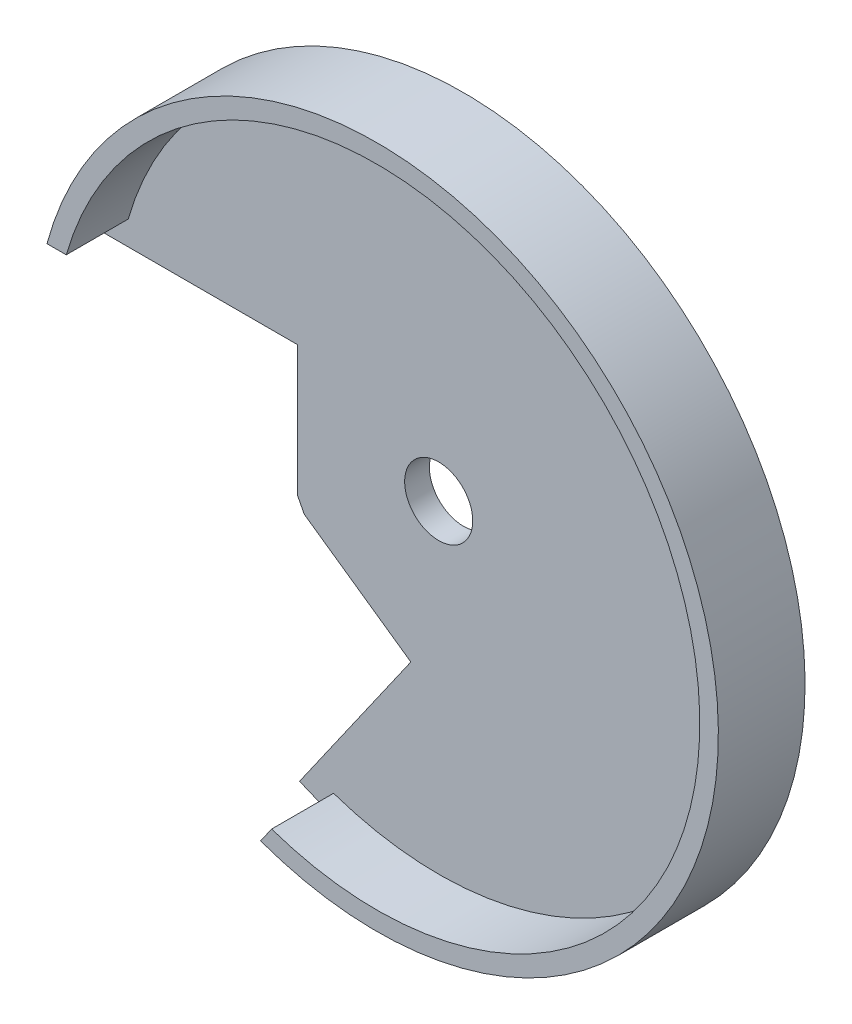
ISO-10303-21;
HEADER;
FILE_DESCRIPTION(('STEP AP214'),'2;1');
FILE_NAME('part.step','',(''),(''),'','','');
FILE_SCHEMA(('AUTOMOTIVE_DESIGN { 1 0 10303 214 1 1 1 1 }'));
ENDSEC;
DATA;
#1=APPLICATION_CONTEXT('core data for automotive mechanical design processes');
#2=APPLICATION_PROTOCOL_DEFINITION('international standard','automotive_design',2000,#1);
#3=PRODUCT_CONTEXT('',#1,'mechanical');
#4=PRODUCT('Part','Part','',(#3));
#5=PRODUCT_RELATED_PRODUCT_CATEGORY('part','',(#4));
#6=PRODUCT_DEFINITION_FORMATION('','',#4);
#7=PRODUCT_DEFINITION_CONTEXT('part definition',#1,'design');
#8=PRODUCT_DEFINITION('design','',#6,#7);
#9=PRODUCT_DEFINITION_SHAPE('','',#8);
#10=(LENGTH_UNIT() NAMED_UNIT(*) SI_UNIT(.MILLI.,.METRE.));
#11=(NAMED_UNIT(*) PLANE_ANGLE_UNIT() SI_UNIT($,.RADIAN.));
#12=(NAMED_UNIT(*) SI_UNIT($,.STERADIAN.) SOLID_ANGLE_UNIT());
#13=UNCERTAINTY_MEASURE_WITH_UNIT(LENGTH_MEASURE(1.E-05),#10,'distance_accuracy_value','');
#14=(GEOMETRIC_REPRESENTATION_CONTEXT(3) GLOBAL_UNCERTAINTY_ASSIGNED_CONTEXT((#13)) GLOBAL_UNIT_ASSIGNED_CONTEXT((#10,
#11,#12)) REPRESENTATION_CONTEXT('',''));
#15=CARTESIAN_POINT('',(0.,0.,0.));
#16=DIRECTION('',(0.,0.,1.));
#17=DIRECTION('',(1.,0.,0.));
#18=AXIS2_PLACEMENT_3D('',#15,#16,#17);
#19=CARTESIAN_POINT('',(2.72554252903729,-1.90844542454305,3.));
#20=DIRECTION('',(0.819152044288993,-0.573576436351044,0.));
#21=DIRECTION('',(0.573576436351044,0.819152044288994,0.));
#22=AXIS2_PLACEMENT_3D('',#19,#20,#21);
#23=PLANE('',#22);
#24=DIRECTION('',(0.,0.,-1.));
#25=VECTOR('',#24,1.);
#26=CARTESIAN_POINT('',(3.79495970659084,-0.381159414044166,7.2));
#27=LINE('',#26,#25);
#28=CARTESIAN_POINT('',(3.79495970659084,-0.381159414044169,0.));
#29=VERTEX_POINT('',#28);
#30=CARTESIAN_POINT('',(3.79495970659084,-0.381159414044169,3.));
#31=VERTEX_POINT('',#30);
#32=EDGE_CURVE('E78',#29,#31,#27,.F.);
#33=ORIENTED_EDGE('',*,*,#32,.F.);
#34=DIRECTION('',(-0.573576436351044,-0.819152044288994,0.));
#35=VECTOR('',#34,1.);
#36=CARTESIAN_POINT('',(2.72554252903729,-1.90844542454305,0.));
#37=LINE('',#36,#35);
#38=CARTESIAN_POINT('',(3.2591057348042,-1.14643819575611,0.));
#39=VERTEX_POINT('',#38);
#40=EDGE_CURVE('E154',#29,#39,#37,.T.);
#41=ORIENTED_EDGE('',*,*,#40,.T.);
#42=DIRECTION('',(0.,0.,-1.));
#43=VECTOR('',#42,1.);
#44=CARTESIAN_POINT('',(3.2591057348042,-1.14643819575611,3.));
#45=LINE('',#44,#43);
#46=CARTESIAN_POINT('',(3.2591057348042,-1.14643819575611,3.));
#47=VERTEX_POINT('',#46);
#48=EDGE_CURVE('E174',#47,#39,#45,.T.);
#49=ORIENTED_EDGE('',*,*,#48,.F.);
#50=DIRECTION('',(-0.573576436351044,-0.819152044288994,0.));
#51=VECTOR('',#50,1.);
#52=CARTESIAN_POINT('',(2.72554252903729,-1.90844542454305,3.));
#53=LINE('',#52,#51);
#54=EDGE_CURVE('E162',#31,#47,#53,.T.);
#55=ORIENTED_EDGE('',*,*,#54,.F.);
#56=EDGE_LOOP('',(#33,#41,#49,#55));
#57=FACE_BOUND('',#56,.T.);
#58=ADVANCED_FACE('F62',(#57),#23,.F.);
#59=CARTESIAN_POINT('',(0.,18.7337143275698,3.));
#60=DIRECTION('',(0.,-1.,0.));
#61=DIRECTION('',(0.,0.,-1.));
#62=AXIS2_PLACEMENT_3D('',#59,#60,#61);
#63=PLANE('',#62);
#64=DIRECTION('',(-1.,0.,0.));
#65=VECTOR('',#64,1.);
#66=CARTESIAN_POINT('',(0.,18.7337143275698,0.));
#67=LINE('',#66,#65);
#68=CARTESIAN_POINT('',(-6.15561373875023,18.7337143275698,0.));
#69=VERTEX_POINT('',#68);
#70=CARTESIAN_POINT('',(-7.08984662878249,18.7337143275698,0.));
#71=VERTEX_POINT('',#70);
#72=EDGE_CURVE('E151',#69,#71,#67,.T.);
#73=ORIENTED_EDGE('',*,*,#72,.F.);
#74=DIRECTION('',(0.,0.,-1.));
#75=VECTOR('',#74,1.);
#76=CARTESIAN_POINT('',(-6.15561373875023,18.7337143275698,7.2));
#77=LINE('',#76,#75);
#78=CARTESIAN_POINT('',(-6.15561373875023,18.7337143275698,3.));
#79=VERTEX_POINT('',#78);
#80=EDGE_CURVE('E137',#69,#79,#77,.F.);
#81=ORIENTED_EDGE('',*,*,#80,.T.);
#82=DIRECTION('',(-1.,0.,0.));
#83=VECTOR('',#82,1.);
#84=CARTESIAN_POINT('',(0.,18.7337143275698,3.));
#85=LINE('',#84,#83);
#86=CARTESIAN_POINT('',(-7.08984662878249,18.7337143275698,3.));
#87=VERTEX_POINT('',#86);
#88=EDGE_CURVE('E175',#79,#87,#85,.T.);
#89=ORIENTED_EDGE('',*,*,#88,.T.);
#90=DIRECTION('',(0.,0.,-1.));
#91=VECTOR('',#90,1.);
#92=CARTESIAN_POINT('',(-7.08984662878249,18.7337143275698,3.));
#93=LINE('',#92,#91);
#94=EDGE_CURVE('E160',#87,#71,#93,.T.);
#95=ORIENTED_EDGE('',*,*,#94,.T.);
#96=EDGE_LOOP('',(#73,#81,#89,#95));
#97=FACE_BOUND('',#96,.T.);
#98=ADVANCED_FACE('F158',(#97),#63,.T.);
#99=CARTESIAN_POINT('',(8.8873210621277,14.4171633228282,3.));
#100=DIRECTION('',(0.,0.,-1.));
#101=DIRECTION('',(-1.,0.,0.));
#102=AXIS2_PLACEMENT_3D('',#99,#100,#101);
#103=CYLINDRICAL_SURFACE('',#102,16.55);
#104=CARTESIAN_POINT('',(8.8873210621277,14.4171633228282,0.));
#105=DIRECTION('',(0.,0.,-1.));
#106=DIRECTION('',(-1.,0.,0.));
#107=AXIS2_PLACEMENT_3D('',#104,#105,#106);
#108=CIRCLE('',#107,16.55);
#109=CARTESIAN_POINT('',(2.1484890263976,-0.698743622976164,0.));
#110=VERTEX_POINT('',#109);
#111=EDGE_CURVE('E184',#39,#110,#108,.T.);
#112=ORIENTED_EDGE('',*,*,#111,.T.);
#113=DIRECTION('',(0.,0.,-1.));
#114=VECTOR('',#113,1.);
#115=CARTESIAN_POINT('',(2.1484890263976,-0.698743622976164,7.2));
#116=LINE('',#115,#114);
#117=CARTESIAN_POINT('',(2.1484890263976,-0.698743622976164,-1.2));
#118=VERTEX_POINT('',#117);
#119=EDGE_CURVE('E168',#110,#118,#116,.T.);
#120=ORIENTED_EDGE('',*,*,#119,.T.);
#121=CARTESIAN_POINT('',(8.8873210621277,14.4171633228282,-1.2));
#122=DIRECTION('',(0.,0.,-1.));
#123=DIRECTION('',(-1.,0.,0.));
#124=AXIS2_PLACEMENT_3D('',#121,#122,#123);
#125=CIRCLE('',#124,16.55);
#126=CARTESIAN_POINT('',(-7.36014027803249,17.5671633228282,-1.2));
#127=VERTEX_POINT('',#126);
#128=EDGE_CURVE('E188',#127,#118,#125,.T.);
#129=ORIENTED_EDGE('',*,*,#128,.F.);
#130=DIRECTION('',(0.,0.,-1.));
#131=VECTOR('',#130,1.);
#132=CARTESIAN_POINT('',(-7.36014027803249,17.5671633228282,7.2));
#133=LINE('',#132,#131);
#134=CARTESIAN_POINT('',(-7.36014027803249,17.5671633228282,0.));
#135=VERTEX_POINT('',#134);
#136=EDGE_CURVE('E242',#135,#127,#133,.T.);
#137=ORIENTED_EDGE('',*,*,#136,.F.);
#138=EDGE_CURVE('E193',#135,#71,#108,.T.);
#139=ORIENTED_EDGE('',*,*,#138,.T.);
#140=ORIENTED_EDGE('',*,*,#94,.F.);
#141=CARTESIAN_POINT('',(8.8873210621277,14.4171633228282,3.));
#142=DIRECTION('',(0.,0.,1.));
#143=DIRECTION('',(1.,0.,0.));
#144=AXIS2_PLACEMENT_3D('',#141,#142,#143);
#145=CIRCLE('',#144,16.55);
#146=EDGE_CURVE('E166',#47,#87,#145,.T.);
#147=ORIENTED_EDGE('',*,*,#146,.F.);
#148=ORIENTED_EDGE('',*,*,#48,.T.);
#149=EDGE_LOOP('',(#112,#120,#129,#137,#139,#140,#147,#148));
#150=FACE_BOUND('',#149,.T.);
#151=ADVANCED_FACE('F64',(#150),#103,.T.);
#152=CARTESIAN_POINT('',(8.8873210621277,14.4171633228282,-1.2));
#153=DIRECTION('',(0.,0.,-1.));
#154=DIRECTION('',(-1.,0.,0.));
#155=AXIS2_PLACEMENT_3D('',#152,#153,#154);
#156=PLANE('',#155);
#157=DIRECTION('',(-0.573576436351044,-0.819152044288993,0.));
#158=VECTOR('',#157,1.);
#159=CARTESIAN_POINT('',(1.76995988873583,-1.23933925642164,-1.2));
#160=LINE('',#159,#158);
#161=CARTESIAN_POINT('',(7.53865141263338,6.99920604494284,-1.2));
#162=VERTEX_POINT('',#161);
#163=EDGE_CURVE('E217',#162,#118,#160,.T.);
#164=ORIENTED_EDGE('',*,*,#163,.F.);
#165=DIRECTION('',(-0.819152044288993,0.573576436351044,0.));
#166=VECTOR('',#165,1.);
#167=CARTESIAN_POINT('',(5.76869152389756,8.23854530136448,-1.2));
#168=LINE('',#167,#166);
#169=CARTESIAN_POINT('',(2.37799353361272,10.6127375939544,-1.2));
#170=VERTEX_POINT('',#169);
#171=EDGE_CURVE('E257',#162,#170,#168,.T.);
#172=ORIENTED_EDGE('',*,*,#171,.T.);
#173=DIRECTION('',(0.461748613235036,-0.887010833178221,0.));
#174=VECTOR('',#173,1.);
#175=CARTESIAN_POINT('',(6.21770014293928,3.23672982462509,-1.2));
#176=LINE('',#175,#174);
#177=CARTESIAN_POINT('',(2.0373210621277,11.2671633228282,-1.2));
#178=VERTEX_POINT('',#177);
#179=EDGE_CURVE('E253',#178,#170,#176,.T.);
#180=ORIENTED_EDGE('',*,*,#179,.F.);
#181=DIRECTION('',(0.,-1.,0.));
#182=VECTOR('',#181,1.);
#183=CARTESIAN_POINT('',(2.0373210621277,0.,-1.2));
#184=LINE('',#183,#182);
#185=CARTESIAN_POINT('',(2.0373210621277,17.5671633228282,-1.2));
#186=VERTEX_POINT('',#185);
#187=EDGE_CURVE('E249',#186,#178,#184,.T.);
#188=ORIENTED_EDGE('',*,*,#187,.F.);
#189=DIRECTION('',(-1.,0.,0.));
#190=VECTOR('',#189,1.);
#191=CARTESIAN_POINT('',(0.,17.5671633228282,-1.2));
#192=LINE('',#191,#190);
#193=EDGE_CURVE('E245',#186,#127,#192,.T.);
#194=ORIENTED_EDGE('',*,*,#193,.T.);
#195=ORIENTED_EDGE('',*,*,#128,.T.);
#196=EDGE_LOOP('',(#164,#172,#180,#188,#194,#195));
#197=FACE_BOUND('',#196,.T.);
#198=CARTESIAN_POINT('',(8.8873210621277,14.4171633228282,-1.2));
#199=DIRECTION('',(0.,0.,-1.));
#200=DIRECTION('',(-1.,0.,0.));
#201=AXIS2_PLACEMENT_3D('',#198,#199,#200);
#202=CIRCLE('',#201,1.65);
#203=CARTESIAN_POINT('',(7.2373210621277,14.4171633228282,-1.2));
#204=VERTEX_POINT('',#203);
#205=EDGE_CURVE('E180',#204,#204,#202,.T.);
#206=ORIENTED_EDGE('',*,*,#205,.F.);
#207=EDGE_LOOP('',(#206));
#208=FACE_BOUND('',#207,.T.);
#209=ADVANCED_FACE('F267',(#197,#208),#156,.T.);
#210=CARTESIAN_POINT('',(8.8873210621277,14.4171633228282,0.));
#211=DIRECTION('',(0.,0.,-1.));
#212=DIRECTION('',(-1.,0.,0.));
#213=AXIS2_PLACEMENT_3D('',#210,#211,#212);
#214=PLANE('',#213);
#215=ORIENTED_EDGE('',*,*,#138,.F.);
#216=DIRECTION('',(-1.,0.,0.));
#217=VECTOR('',#216,1.);
#218=CARTESIAN_POINT('',(8.8873210621277,17.5671633228282,0.));
#219=LINE('',#218,#217);
#220=CARTESIAN_POINT('',(2.0373210621277,17.5671633228282,0.));
#221=VERTEX_POINT('',#220);
#222=EDGE_CURVE('E192',#221,#135,#219,.T.);
#223=ORIENTED_EDGE('',*,*,#222,.F.);
#224=DIRECTION('',(0.,-1.,0.));
#225=VECTOR('',#224,1.);
#226=CARTESIAN_POINT('',(2.0373210621277,14.4171633228282,0.));
#227=LINE('',#226,#225);
#228=CARTESIAN_POINT('',(2.0373210621277,11.2671633228282,0.));
#229=VERTEX_POINT('',#228);
#230=EDGE_CURVE('E198',#221,#229,#227,.T.);
#231=ORIENTED_EDGE('',*,*,#230,.T.);
#232=DIRECTION('',(0.461748613235036,-0.887010833178221,0.));
#233=VECTOR('',#232,1.);
#234=CARTESIAN_POINT('',(2.20765729787021,10.9399504583913,0.));
#235=LINE('',#234,#233);
#236=CARTESIAN_POINT('',(2.37799353361272,10.6127375939544,0.));
#237=VERTEX_POINT('',#236);
#238=EDGE_CURVE('E202',#229,#237,#235,.T.);
#239=ORIENTED_EDGE('',*,*,#238,.T.);
#240=DIRECTION('',(-0.819152044288993,0.573576436351044,0.));
#241=VECTOR('',#240,1.);
#242=CARTESIAN_POINT('',(4.95832247312305,8.80597181944863,0.));
#243=LINE('',#242,#241);
#244=CARTESIAN_POINT('',(7.53865141263338,6.99920604494284,0.));
#245=VERTEX_POINT('',#244);
#246=EDGE_CURVE('E206',#245,#237,#243,.T.);
#247=ORIENTED_EDGE('',*,*,#246,.F.);
#248=DIRECTION('',(-0.573576436351044,-0.819152044288994,0.));
#249=VECTOR('',#248,1.);
#250=CARTESIAN_POINT('',(11.467650001638,12.6103975483225,0.));
#251=LINE('',#250,#249);
#252=EDGE_CURVE('E71',#245,#110,#251,.T.);
#253=ORIENTED_EDGE('',*,*,#252,.T.);
#254=ORIENTED_EDGE('',*,*,#111,.F.);
#255=ORIENTED_EDGE('',*,*,#40,.F.);
#256=CARTESIAN_POINT('',(8.8873210621277,14.4171633228282,0.));
#257=DIRECTION('',(0.,0.,1.));
#258=DIRECTION('',(1.,0.,0.));
#259=AXIS2_PLACEMENT_3D('',#256,#257,#258);
#260=CIRCLE('',#259,15.65);
#261=EDGE_CURVE('E140',#29,#69,#260,.T.);
#262=ORIENTED_EDGE('',*,*,#261,.T.);
#263=ORIENTED_EDGE('',*,*,#72,.T.);
#264=EDGE_LOOP('',(#215,#223,#231,#239,#247,#253,#254,#255,#262,#263));
#265=FACE_BOUND('',#264,.T.);
#266=CARTESIAN_POINT('',(8.8873210621277,14.4171633228282,0.));
#267=DIRECTION('',(0.,0.,-1.));
#268=DIRECTION('',(-1.,0.,0.));
#269=AXIS2_PLACEMENT_3D('',#266,#267,#268);
#270=CIRCLE('',#269,1.65);
#271=CARTESIAN_POINT('',(7.2373210621277,14.4171633228282,0.));
#272=VERTEX_POINT('',#271);
#273=EDGE_CURVE('E179',#272,#272,#270,.T.);
#274=ORIENTED_EDGE('',*,*,#273,.T.);
#275=EDGE_LOOP('',(#274));
#276=FACE_BOUND('',#275,.T.);
#277=ADVANCED_FACE('F149',(#265,#276),#214,.F.);
#278=CARTESIAN_POINT('',(8.8873210621277,14.4171633228282,-1.2));
#279=DIRECTION('',(0.,0.,1.));
#280=DIRECTION('',(1.,0.,0.));
#281=AXIS2_PLACEMENT_3D('',#278,#279,#280);
#282=CYLINDRICAL_SURFACE('',#281,1.65);
#283=ORIENTED_EDGE('',*,*,#205,.T.);
#284=EDGE_LOOP('',(#283));
#285=FACE_BOUND('',#284,.T.);
#286=ORIENTED_EDGE('',*,*,#273,.F.);
#287=EDGE_LOOP('',(#286));
#288=FACE_BOUND('',#287,.T.);
#289=ADVANCED_FACE('F299',(#285,#288),#282,.F.);
#290=CARTESIAN_POINT('',(0.,0.,3.));
#291=DIRECTION('',(0.,0.,1.));
#292=DIRECTION('',(1.,0.,0.));
#293=AXIS2_PLACEMENT_3D('',#290,#291,#292);
#294=PLANE('',#293);
#295=ORIENTED_EDGE('',*,*,#88,.F.);
#296=CARTESIAN_POINT('',(8.8873210621277,14.4171633228282,3.));
#297=DIRECTION('',(0.,0.,1.));
#298=DIRECTION('',(1.,0.,0.));
#299=AXIS2_PLACEMENT_3D('',#296,#297,#298);
#300=CIRCLE('',#299,15.65);
#301=EDGE_CURVE('E12',#79,#31,#300,.F.);
#302=ORIENTED_EDGE('',*,*,#301,.T.);
#303=ORIENTED_EDGE('',*,*,#54,.T.);
#304=ORIENTED_EDGE('',*,*,#146,.T.);
#305=EDGE_LOOP('',(#295,#302,#303,#304));
#306=FACE_BOUND('',#305,.T.);
#307=ADVANCED_FACE('F302',(#306),#294,.T.);
#308=CARTESIAN_POINT('',(1.76995988873583,-1.23933925642164,7.2));
#309=DIRECTION('',(0.819152044288993,-0.573576436351044,0.));
#310=DIRECTION('',(0.573576436351044,0.819152044288994,0.));
#311=AXIS2_PLACEMENT_3D('',#308,#309,#310);
#312=PLANE('',#311);
#313=DIRECTION('',(0.,0.,-1.));
#314=VECTOR('',#313,1.);
#315=CARTESIAN_POINT('',(7.53865141263338,6.99920604494284,7.2));
#316=LINE('',#315,#314);
#317=EDGE_CURVE('E221',#245,#162,#316,.T.);
#318=ORIENTED_EDGE('',*,*,#317,.T.);
#319=ORIENTED_EDGE('',*,*,#163,.T.);
#320=ORIENTED_EDGE('',*,*,#119,.F.);
#321=ORIENTED_EDGE('',*,*,#252,.F.);
#322=EDGE_LOOP('',(#318,#319,#320,#321));
#323=FACE_BOUND('',#322,.T.);
#324=ADVANCED_FACE('F215',(#323),#312,.F.);
#325=CARTESIAN_POINT('',(5.76869152389756,8.23854530136448,7.2));
#326=DIRECTION('',(-0.573576436351044,-0.819152044288993,0.));
#327=DIRECTION('',(0.819152044288993,-0.573576436351044,0.));
#328=AXIS2_PLACEMENT_3D('',#325,#326,#327);
#329=PLANE('',#328);
#330=ORIENTED_EDGE('',*,*,#246,.T.);
#331=DIRECTION('',(0.,0.,-1.));
#332=VECTOR('',#331,1.);
#333=CARTESIAN_POINT('',(2.37799353361272,10.6127375939544,7.2));
#334=LINE('',#333,#332);
#335=EDGE_CURVE('E234',#237,#170,#334,.T.);
#336=ORIENTED_EDGE('',*,*,#335,.T.);
#337=ORIENTED_EDGE('',*,*,#171,.F.);
#338=ORIENTED_EDGE('',*,*,#317,.F.);
#339=EDGE_LOOP('',(#330,#336,#337,#338));
#340=FACE_BOUND('',#339,.T.);
#341=ADVANCED_FACE('F271',(#340),#329,.T.);
#342=CARTESIAN_POINT('',(6.21770014293928,3.23672982462509,7.2));
#343=DIRECTION('',(0.887010833178221,0.461748613235035,0.));
#344=DIRECTION('',(-0.461748613235036,0.887010833178221,0.));
#345=AXIS2_PLACEMENT_3D('',#342,#343,#344);
#346=PLANE('',#345);
#347=DIRECTION('',(0.,0.,-1.));
#348=VECTOR('',#347,1.);
#349=CARTESIAN_POINT('',(2.0373210621277,11.2671633228282,7.2));
#350=LINE('',#349,#348);
#351=EDGE_CURVE('E237',#229,#178,#350,.T.);
#352=ORIENTED_EDGE('',*,*,#351,.T.);
#353=ORIENTED_EDGE('',*,*,#179,.T.);
#354=ORIENTED_EDGE('',*,*,#335,.F.);
#355=ORIENTED_EDGE('',*,*,#238,.F.);
#356=EDGE_LOOP('',(#352,#353,#354,#355));
#357=FACE_BOUND('',#356,.T.);
#358=ADVANCED_FACE('F274',(#357),#346,.F.);
#359=CARTESIAN_POINT('',(2.0373210621277,0.,7.2));
#360=DIRECTION('',(1.,0.,0.));
#361=DIRECTION('',(0.,1.,0.));
#362=AXIS2_PLACEMENT_3D('',#359,#360,#361);
#363=PLANE('',#362);
#364=DIRECTION('',(0.,0.,-1.));
#365=VECTOR('',#364,1.);
#366=CARTESIAN_POINT('',(2.0373210621277,17.5671633228282,7.2));
#367=LINE('',#366,#365);
#368=EDGE_CURVE('E85',#221,#186,#367,.T.);
#369=ORIENTED_EDGE('',*,*,#368,.T.);
#370=ORIENTED_EDGE('',*,*,#187,.T.);
#371=ORIENTED_EDGE('',*,*,#351,.F.);
#372=ORIENTED_EDGE('',*,*,#230,.F.);
#373=EDGE_LOOP('',(#369,#370,#371,#372));
#374=FACE_BOUND('',#373,.T.);
#375=ADVANCED_FACE('F277',(#374),#363,.F.);
#376=CARTESIAN_POINT('',(0.,17.5671633228282,7.2));
#377=DIRECTION('',(0.,-1.,0.));
#378=DIRECTION('',(1.,0.,0.));
#379=AXIS2_PLACEMENT_3D('',#376,#377,#378);
#380=PLANE('',#379);
#381=ORIENTED_EDGE('',*,*,#222,.T.);
#382=ORIENTED_EDGE('',*,*,#136,.T.);
#383=ORIENTED_EDGE('',*,*,#193,.F.);
#384=ORIENTED_EDGE('',*,*,#368,.F.);
#385=EDGE_LOOP('',(#381,#382,#383,#384));
#386=FACE_BOUND('',#385,.T.);
#387=ADVANCED_FACE('F280',(#386),#380,.T.);
#388=CARTESIAN_POINT('',(8.8873210621277,14.4171633228282,7.2));
#389=DIRECTION('',(0.,0.,-1.));
#390=DIRECTION('',(-1.,0.,0.));
#391=AXIS2_PLACEMENT_3D('',#388,#389,#390);
#392=CYLINDRICAL_SURFACE('',#391,15.65);
#393=ORIENTED_EDGE('',*,*,#32,.T.);
#394=ORIENTED_EDGE('',*,*,#301,.F.);
#395=ORIENTED_EDGE('',*,*,#80,.F.);
#396=ORIENTED_EDGE('',*,*,#261,.F.);
#397=EDGE_LOOP('',(#393,#394,#395,#396));
#398=FACE_BOUND('',#397,.T.);
#399=ADVANCED_FACE('F139',(#398),#392,.F.);
#400=CLOSED_SHELL('',(#58,#98,#151,#209,#277,#289,#307,#324,#341,#358,#375,#387,#399));
#401=MANIFOLD_SOLID_BREP('B2',#400);
#402=ADVANCED_BREP_SHAPE_REPRESENTATION('',(#18,#401),#14);
#403=SHAPE_DEFINITION_REPRESENTATION(#9,#402);
ENDSEC;
END-ISO-10303-21;
